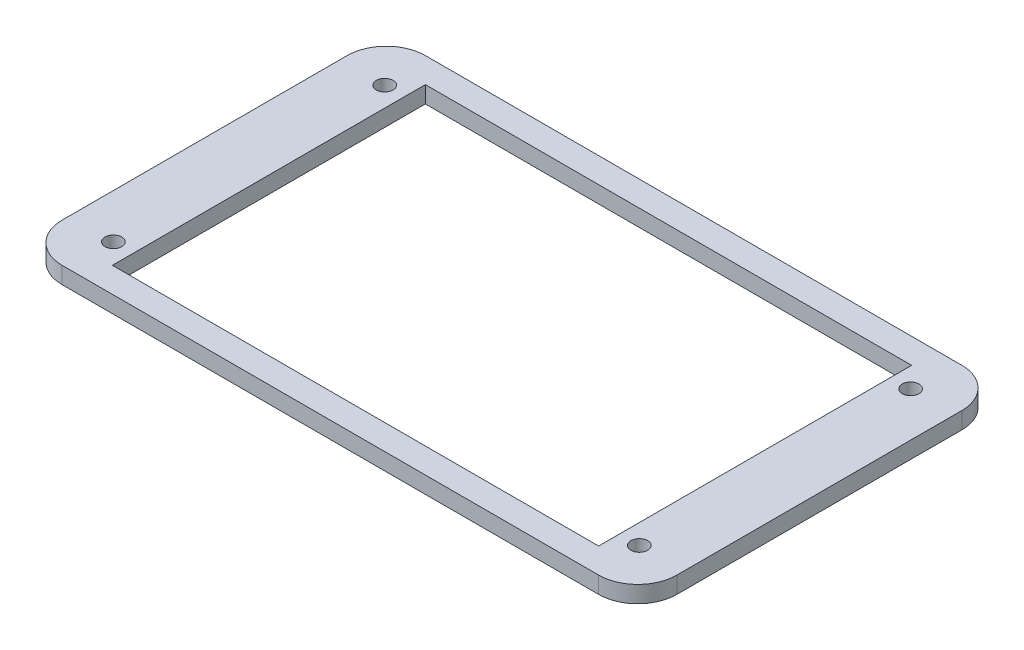
ISO-10303-21;
HEADER;
FILE_DESCRIPTION(('STEP AP214'),'2;1');
FILE_NAME('part.step','',(''),(''),'','','');
FILE_SCHEMA(('AUTOMOTIVE_DESIGN { 1 0 10303 214 1 1 1 1 }'));
ENDSEC;
DATA;
#1=APPLICATION_CONTEXT('core data for automotive mechanical design processes');
#2=APPLICATION_PROTOCOL_DEFINITION('international standard','automotive_design',2000,#1);
#3=PRODUCT_CONTEXT('',#1,'mechanical');
#4=PRODUCT('Part','Part','',(#3));
#5=PRODUCT_RELATED_PRODUCT_CATEGORY('part','',(#4));
#6=PRODUCT_DEFINITION_FORMATION('','',#4);
#7=PRODUCT_DEFINITION_CONTEXT('part definition',#1,'design');
#8=PRODUCT_DEFINITION('design','',#6,#7);
#9=PRODUCT_DEFINITION_SHAPE('','',#8);
#10=(LENGTH_UNIT() NAMED_UNIT(*) SI_UNIT(.MILLI.,.METRE.));
#11=(NAMED_UNIT(*) PLANE_ANGLE_UNIT() SI_UNIT($,.RADIAN.));
#12=(NAMED_UNIT(*) SI_UNIT($,.STERADIAN.) SOLID_ANGLE_UNIT());
#13=UNCERTAINTY_MEASURE_WITH_UNIT(LENGTH_MEASURE(1.E-05),#10,'distance_accuracy_value','');
#14=(GEOMETRIC_REPRESENTATION_CONTEXT(3) GLOBAL_UNCERTAINTY_ASSIGNED_CONTEXT((#13)) GLOBAL_UNIT_ASSIGNED_CONTEXT((#10,
#11,#12)) REPRESENTATION_CONTEXT('',''));
#15=CARTESIAN_POINT('',(0.,0.,0.));
#16=DIRECTION('',(0.,0.,1.));
#17=DIRECTION('',(1.,0.,0.));
#18=AXIS2_PLACEMENT_3D('',#15,#16,#17);
#19=CARTESIAN_POINT('',(-48.,1.5,25.5));
#20=DIRECTION('',(0.,-1.,0.));
#21=DIRECTION('',(0.,0.,-1.));
#22=AXIS2_PLACEMENT_3D('',#19,#20,#21);
#23=PLANE('',#22);
#24=DIRECTION('',(1.,0.,0.));
#25=VECTOR('',#24,1.);
#26=CARTESIAN_POINT('',(43.5,1.5,28.));
#27=LINE('',#26,#25);
#28=CARTESIAN_POINT('',(-43.5,1.5,28.));
#29=VERTEX_POINT('',#28);
#30=CARTESIAN_POINT('',(43.5,1.5,28.));
#31=VERTEX_POINT('',#30);
#32=EDGE_CURVE('E152',#29,#31,#27,.T.);
#33=ORIENTED_EDGE('',*,*,#32,.F.);
#34=DIRECTION('',(0.,0.,1.));
#35=VECTOR('',#34,1.);
#36=CARTESIAN_POINT('',(-43.5,1.5,28.));
#37=LINE('',#36,#35);
#38=CARTESIAN_POINT('',(-43.5,1.5,-28.));
#39=VERTEX_POINT('',#38);
#40=EDGE_CURVE('E54',#39,#29,#37,.T.);
#41=ORIENTED_EDGE('',*,*,#40,.F.);
#42=DIRECTION('',(-1.,0.,0.));
#43=VECTOR('',#42,1.);
#44=CARTESIAN_POINT('',(43.5,1.5,-28.));
#45=LINE('',#44,#43);
#46=CARTESIAN_POINT('',(43.5,1.5,-28.));
#47=VERTEX_POINT('',#46);
#48=EDGE_CURVE('E142',#47,#39,#45,.T.);
#49=ORIENTED_EDGE('',*,*,#48,.F.);
#50=DIRECTION('',(0.,0.,-1.));
#51=VECTOR('',#50,1.);
#52=CARTESIAN_POINT('',(43.5,1.5,28.));
#53=LINE('',#52,#51);
#54=EDGE_CURVE('E160',#31,#47,#53,.T.);
#55=ORIENTED_EDGE('',*,*,#54,.F.);
#56=EDGE_LOOP('',(#33,#41,#49,#55));
#57=FACE_BOUND('',#56,.T.);
#58=CARTESIAN_POINT('',(-48.,1.5,25.5));
#59=DIRECTION('',(0.,1.,0.));
#60=DIRECTION('',(0.,0.,-1.));
#61=AXIS2_PLACEMENT_3D('',#58,#59,#60);
#62=CIRCLE('',#61,7.00000000000001);
#63=CARTESIAN_POINT('',(-55.,1.5,25.5));
#64=VERTEX_POINT('',#63);
#65=CARTESIAN_POINT('',(-48.,1.5,32.5));
#66=VERTEX_POINT('',#65);
#67=EDGE_CURVE('E206',#64,#66,#62,.T.);
#68=ORIENTED_EDGE('',*,*,#67,.T.);
#69=DIRECTION('',(1.,0.,0.));
#70=VECTOR('',#69,1.);
#71=CARTESIAN_POINT('',(48.,1.5,32.5));
#72=LINE('',#71,#70);
#73=CARTESIAN_POINT('',(48.,1.5,32.5));
#74=VERTEX_POINT('',#73);
#75=EDGE_CURVE('E210',#66,#74,#72,.T.);
#76=ORIENTED_EDGE('',*,*,#75,.T.);
#77=CARTESIAN_POINT('',(48.,1.5,25.5));
#78=DIRECTION('',(0.,1.,0.));
#79=DIRECTION('',(0.,0.,1.));
#80=AXIS2_PLACEMENT_3D('',#77,#78,#79);
#81=CIRCLE('',#80,7.);
#82=CARTESIAN_POINT('',(55.,1.5,25.5));
#83=VERTEX_POINT('',#82);
#84=EDGE_CURVE('E214',#74,#83,#81,.T.);
#85=ORIENTED_EDGE('',*,*,#84,.T.);
#86=DIRECTION('',(0.,0.,-1.));
#87=VECTOR('',#86,1.);
#88=CARTESIAN_POINT('',(55.,1.5,25.5));
#89=LINE('',#88,#87);
#90=CARTESIAN_POINT('',(55.,1.5,-25.5));
#91=VERTEX_POINT('',#90);
#92=EDGE_CURVE('E217',#83,#91,#89,.T.);
#93=ORIENTED_EDGE('',*,*,#92,.T.);
#94=CARTESIAN_POINT('',(48.,1.5,-25.5));
#95=DIRECTION('',(0.,1.,0.));
#96=DIRECTION('',(0.,0.,1.));
#97=AXIS2_PLACEMENT_3D('',#94,#95,#96);
#98=CIRCLE('',#97,6.99999999999999);
#99=CARTESIAN_POINT('',(48.,1.5,-32.5));
#100=VERTEX_POINT('',#99);
#101=EDGE_CURVE('E220',#91,#100,#98,.T.);
#102=ORIENTED_EDGE('',*,*,#101,.T.);
#103=DIRECTION('',(-1.,0.,0.));
#104=VECTOR('',#103,1.);
#105=CARTESIAN_POINT('',(48.,1.5,-32.5));
#106=LINE('',#105,#104);
#107=CARTESIAN_POINT('',(-48.,1.5,-32.5));
#108=VERTEX_POINT('',#107);
#109=EDGE_CURVE('E223',#100,#108,#106,.T.);
#110=ORIENTED_EDGE('',*,*,#109,.T.);
#111=CARTESIAN_POINT('',(-48.,1.5,-25.5));
#112=DIRECTION('',(0.,1.,0.));
#113=DIRECTION('',(0.,0.,1.));
#114=AXIS2_PLACEMENT_3D('',#111,#112,#113);
#115=CIRCLE('',#114,7.);
#116=CARTESIAN_POINT('',(-55.,1.5,-25.5));
#117=VERTEX_POINT('',#116);
#118=EDGE_CURVE('E226',#108,#117,#115,.T.);
#119=ORIENTED_EDGE('',*,*,#118,.T.);
#120=DIRECTION('',(0.,0.,1.));
#121=VECTOR('',#120,1.);
#122=CARTESIAN_POINT('',(-55.,1.5,25.5));
#123=LINE('',#122,#121);
#124=EDGE_CURVE('E229',#117,#64,#123,.T.);
#125=ORIENTED_EDGE('',*,*,#124,.T.);
#126=EDGE_LOOP('',(#68,#76,#85,#93,#102,#110,#119,#125));
#127=FACE_BOUND('',#126,.T.);
#128=CARTESIAN_POINT('',(-47.05,1.5,-24.27));
#129=DIRECTION('',(0.,1.,0.));
#130=DIRECTION('',(0.,0.,1.));
#131=AXIS2_PLACEMENT_3D('',#128,#129,#130);
#132=CIRCLE('',#131,1.5);
#133=CARTESIAN_POINT('',(-47.05,1.5,-22.77));
#134=VERTEX_POINT('',#133);
#135=EDGE_CURVE('E198',#134,#134,#132,.T.);
#136=ORIENTED_EDGE('',*,*,#135,.F.);
#137=EDGE_LOOP('',(#136));
#138=FACE_BOUND('',#137,.T.);
#139=CARTESIAN_POINT('',(-47.05,1.5,24.27));
#140=DIRECTION('',(0.,1.,0.));
#141=DIRECTION('',(0.,0.,1.));
#142=AXIS2_PLACEMENT_3D('',#139,#140,#141);
#143=CIRCLE('',#142,1.5);
#144=CARTESIAN_POINT('',(-47.05,1.5,25.77));
#145=VERTEX_POINT('',#144);
#146=EDGE_CURVE('E190',#145,#145,#143,.T.);
#147=ORIENTED_EDGE('',*,*,#146,.F.);
#148=EDGE_LOOP('',(#147));
#149=FACE_BOUND('',#148,.T.);
#150=CARTESIAN_POINT('',(47.05,1.5,24.27));
#151=DIRECTION('',(0.,1.,0.));
#152=DIRECTION('',(0.,0.,1.));
#153=AXIS2_PLACEMENT_3D('',#150,#151,#152);
#154=CIRCLE('',#153,1.5);
#155=CARTESIAN_POINT('',(47.05,1.5,25.77));
#156=VERTEX_POINT('',#155);
#157=EDGE_CURVE('E182',#156,#156,#154,.T.);
#158=ORIENTED_EDGE('',*,*,#157,.F.);
#159=EDGE_LOOP('',(#158));
#160=FACE_BOUND('',#159,.T.);
#161=CARTESIAN_POINT('',(47.05,1.5,-24.27));
#162=DIRECTION('',(0.,1.,0.));
#163=DIRECTION('',(0.,0.,1.));
#164=AXIS2_PLACEMENT_3D('',#161,#162,#163);
#165=CIRCLE('',#164,1.5);
#166=CARTESIAN_POINT('',(47.05,1.5,-22.77));
#167=VERTEX_POINT('',#166);
#168=EDGE_CURVE('E174',#167,#167,#165,.T.);
#169=ORIENTED_EDGE('',*,*,#168,.F.);
#170=EDGE_LOOP('',(#169));
#171=FACE_BOUND('',#170,.T.);
#172=ADVANCED_FACE('F38',(#57,#127,#138,#149,#160,#171),#23,.F.);
#173=CARTESIAN_POINT('',(-48.,-1.5,25.5));
#174=DIRECTION('',(0.,-1.,0.));
#175=DIRECTION('',(0.,0.,-1.));
#176=AXIS2_PLACEMENT_3D('',#173,#174,#175);
#177=PLANE('',#176);
#178=DIRECTION('',(0.,0.,1.));
#179=VECTOR('',#178,1.);
#180=CARTESIAN_POINT('',(-43.5,-1.5,28.));
#181=LINE('',#180,#179);
#182=CARTESIAN_POINT('',(-43.5,-1.5,-28.));
#183=VERTEX_POINT('',#182);
#184=CARTESIAN_POINT('',(-43.5,-1.5,28.));
#185=VERTEX_POINT('',#184);
#186=EDGE_CURVE('E139',#183,#185,#181,.T.);
#187=ORIENTED_EDGE('',*,*,#186,.T.);
#188=DIRECTION('',(1.,0.,0.));
#189=VECTOR('',#188,1.);
#190=CARTESIAN_POINT('',(43.5,-1.5,28.));
#191=LINE('',#190,#189);
#192=CARTESIAN_POINT('',(43.5,-1.5,28.));
#193=VERTEX_POINT('',#192);
#194=EDGE_CURVE('E127',#185,#193,#191,.T.);
#195=ORIENTED_EDGE('',*,*,#194,.T.);
#196=DIRECTION('',(0.,0.,-1.));
#197=VECTOR('',#196,1.);
#198=CARTESIAN_POINT('',(43.5,-1.5,28.));
#199=LINE('',#198,#197);
#200=CARTESIAN_POINT('',(43.5,-1.5,-28.));
#201=VERTEX_POINT('',#200);
#202=EDGE_CURVE('E154',#193,#201,#199,.T.);
#203=ORIENTED_EDGE('',*,*,#202,.T.);
#204=DIRECTION('',(-1.,0.,0.));
#205=VECTOR('',#204,1.);
#206=CARTESIAN_POINT('',(43.5,-1.5,-28.));
#207=LINE('',#206,#205);
#208=EDGE_CURVE('E147',#201,#183,#207,.T.);
#209=ORIENTED_EDGE('',*,*,#208,.T.);
#210=EDGE_LOOP('',(#187,#195,#203,#209));
#211=FACE_BOUND('',#210,.T.);
#212=CARTESIAN_POINT('',(47.05,-1.5,24.27));
#213=DIRECTION('',(0.,1.,0.));
#214=DIRECTION('',(0.,0.,1.));
#215=AXIS2_PLACEMENT_3D('',#212,#213,#214);
#216=CIRCLE('',#215,1.5);
#217=CARTESIAN_POINT('',(47.05,-1.5,25.77));
#218=VERTEX_POINT('',#217);
#219=EDGE_CURVE('E178',#218,#218,#216,.T.);
#220=ORIENTED_EDGE('',*,*,#219,.T.);
#221=EDGE_LOOP('',(#220));
#222=FACE_BOUND('',#221,.T.);
#223=CARTESIAN_POINT('',(-47.05,-1.5,-24.27));
#224=DIRECTION('',(0.,1.,0.));
#225=DIRECTION('',(0.,0.,1.));
#226=AXIS2_PLACEMENT_3D('',#223,#224,#225);
#227=CIRCLE('',#226,1.5);
#228=CARTESIAN_POINT('',(-47.05,-1.5,-22.77));
#229=VERTEX_POINT('',#228);
#230=EDGE_CURVE('E194',#229,#229,#227,.T.);
#231=ORIENTED_EDGE('',*,*,#230,.T.);
#232=EDGE_LOOP('',(#231));
#233=FACE_BOUND('',#232,.T.);
#234=CARTESIAN_POINT('',(-48.,-1.5,25.5));
#235=DIRECTION('',(0.,1.,0.));
#236=DIRECTION('',(0.,0.,-1.));
#237=AXIS2_PLACEMENT_3D('',#234,#235,#236);
#238=CIRCLE('',#237,7.00000000000001);
#239=CARTESIAN_POINT('',(-55.,-1.5,25.5));
#240=VERTEX_POINT('',#239);
#241=CARTESIAN_POINT('',(-48.,-1.5,32.5));
#242=VERTEX_POINT('',#241);
#243=EDGE_CURVE('E202',#240,#242,#238,.T.);
#244=ORIENTED_EDGE('',*,*,#243,.F.);
#245=DIRECTION('',(0.,0.,1.));
#246=VECTOR('',#245,1.);
#247=CARTESIAN_POINT('',(-55.,-1.5,25.5));
#248=LINE('',#247,#246);
#249=CARTESIAN_POINT('',(-55.,-1.5,-25.5));
#250=VERTEX_POINT('',#249);
#251=EDGE_CURVE('E211',#250,#240,#248,.T.);
#252=ORIENTED_EDGE('',*,*,#251,.F.);
#253=CARTESIAN_POINT('',(-48.,-1.5,-25.5));
#254=DIRECTION('',(0.,1.,0.));
#255=DIRECTION('',(0.,0.,1.));
#256=AXIS2_PLACEMENT_3D('',#253,#254,#255);
#257=CIRCLE('',#256,7.);
#258=CARTESIAN_POINT('',(-48.,-1.5,-32.5));
#259=VERTEX_POINT('',#258);
#260=EDGE_CURVE('E251',#259,#250,#257,.T.);
#261=ORIENTED_EDGE('',*,*,#260,.F.);
#262=DIRECTION('',(-1.,0.,0.));
#263=VECTOR('',#262,1.);
#264=CARTESIAN_POINT('',(48.,-1.5,-32.5));
#265=LINE('',#264,#263);
#266=CARTESIAN_POINT('',(48.,-1.5,-32.5));
#267=VERTEX_POINT('',#266);
#268=EDGE_CURVE('E248',#267,#259,#265,.T.);
#269=ORIENTED_EDGE('',*,*,#268,.F.);
#270=CARTESIAN_POINT('',(48.,-1.5,-25.5));
#271=DIRECTION('',(0.,1.,0.));
#272=DIRECTION('',(0.,0.,1.));
#273=AXIS2_PLACEMENT_3D('',#270,#271,#272);
#274=CIRCLE('',#273,6.99999999999999);
#275=CARTESIAN_POINT('',(55.,-1.5,-25.5));
#276=VERTEX_POINT('',#275);
#277=EDGE_CURVE('E245',#276,#267,#274,.T.);
#278=ORIENTED_EDGE('',*,*,#277,.F.);
#279=DIRECTION('',(0.,0.,-1.));
#280=VECTOR('',#279,1.);
#281=CARTESIAN_POINT('',(55.,-1.5,25.5));
#282=LINE('',#281,#280);
#283=CARTESIAN_POINT('',(55.,-1.5,25.5));
#284=VERTEX_POINT('',#283);
#285=EDGE_CURVE('E242',#284,#276,#282,.T.);
#286=ORIENTED_EDGE('',*,*,#285,.F.);
#287=CARTESIAN_POINT('',(48.,-1.5,25.5));
#288=DIRECTION('',(0.,1.,0.));
#289=DIRECTION('',(0.,0.,1.));
#290=AXIS2_PLACEMENT_3D('',#287,#288,#289);
#291=CIRCLE('',#290,7.);
#292=CARTESIAN_POINT('',(48.,-1.5,32.5));
#293=VERTEX_POINT('',#292);
#294=EDGE_CURVE('E239',#293,#284,#291,.T.);
#295=ORIENTED_EDGE('',*,*,#294,.F.);
#296=DIRECTION('',(1.,0.,0.));
#297=VECTOR('',#296,1.);
#298=CARTESIAN_POINT('',(48.,-1.5,32.5));
#299=LINE('',#298,#297);
#300=EDGE_CURVE('E236',#242,#293,#299,.T.);
#301=ORIENTED_EDGE('',*,*,#300,.F.);
#302=EDGE_LOOP('',(#244,#252,#261,#269,#278,#286,#295,#301));
#303=FACE_BOUND('',#302,.T.);
#304=CARTESIAN_POINT('',(-47.05,-1.5,24.27));
#305=DIRECTION('',(0.,1.,0.));
#306=DIRECTION('',(0.,0.,1.));
#307=AXIS2_PLACEMENT_3D('',#304,#305,#306);
#308=CIRCLE('',#307,1.5);
#309=CARTESIAN_POINT('',(-47.05,-1.5,25.77));
#310=VERTEX_POINT('',#309);
#311=EDGE_CURVE('E186',#310,#310,#308,.T.);
#312=ORIENTED_EDGE('',*,*,#311,.T.);
#313=EDGE_LOOP('',(#312));
#314=FACE_BOUND('',#313,.T.);
#315=CARTESIAN_POINT('',(47.05,-1.5,-24.27));
#316=DIRECTION('',(0.,1.,0.));
#317=DIRECTION('',(0.,0.,1.));
#318=AXIS2_PLACEMENT_3D('',#315,#316,#317);
#319=CIRCLE('',#318,1.5);
#320=CARTESIAN_POINT('',(47.05,-1.5,-22.77));
#321=VERTEX_POINT('',#320);
#322=EDGE_CURVE('E135',#321,#321,#319,.T.);
#323=ORIENTED_EDGE('',*,*,#322,.T.);
#324=EDGE_LOOP('',(#323));
#325=FACE_BOUND('',#324,.T.);
#326=ADVANCED_FACE('F145',(#211,#222,#233,#303,#314,#325),#177,.T.);
#327=CARTESIAN_POINT('',(-48.,1.5,25.5));
#328=DIRECTION('',(0.,-1.,0.));
#329=DIRECTION('',(0.,0.,-1.));
#330=AXIS2_PLACEMENT_3D('',#327,#328,#329);
#331=CYLINDRICAL_SURFACE('',#330,7.00000000000001);
#332=ORIENTED_EDGE('',*,*,#243,.T.);
#333=DIRECTION('',(0.,-1.,0.));
#334=VECTOR('',#333,1.);
#335=CARTESIAN_POINT('',(-48.,1.5,32.5));
#336=LINE('',#335,#334);
#337=EDGE_CURVE('E11',#66,#242,#336,.T.);
#338=ORIENTED_EDGE('',*,*,#337,.F.);
#339=ORIENTED_EDGE('',*,*,#67,.F.);
#340=DIRECTION('',(0.,-1.,0.));
#341=VECTOR('',#340,1.);
#342=CARTESIAN_POINT('',(-55.,1.5,25.5));
#343=LINE('',#342,#341);
#344=EDGE_CURVE('E232',#64,#240,#343,.T.);
#345=ORIENTED_EDGE('',*,*,#344,.T.);
#346=EDGE_LOOP('',(#332,#338,#339,#345));
#347=FACE_BOUND('',#346,.T.);
#348=ADVANCED_FACE('F40',(#347),#331,.T.);
#349=CARTESIAN_POINT('',(48.,1.5,32.5));
#350=DIRECTION('',(0.,0.,-1.));
#351=DIRECTION('',(-1.,0.,0.));
#352=AXIS2_PLACEMENT_3D('',#349,#350,#351);
#353=PLANE('',#352);
#354=ORIENTED_EDGE('',*,*,#300,.T.);
#355=DIRECTION('',(0.,-1.,0.));
#356=VECTOR('',#355,1.);
#357=CARTESIAN_POINT('',(48.,1.5,32.5));
#358=LINE('',#357,#356);
#359=EDGE_CURVE('E47',#74,#293,#358,.T.);
#360=ORIENTED_EDGE('',*,*,#359,.F.);
#361=ORIENTED_EDGE('',*,*,#75,.F.);
#362=ORIENTED_EDGE('',*,*,#337,.T.);
#363=EDGE_LOOP('',(#354,#360,#361,#362));
#364=FACE_BOUND('',#363,.T.);
#365=ADVANCED_FACE('F307',(#364),#353,.F.);
#366=CARTESIAN_POINT('',(48.,1.5,25.5));
#367=DIRECTION('',(0.,-1.,0.));
#368=DIRECTION('',(0.,0.,-1.));
#369=AXIS2_PLACEMENT_3D('',#366,#367,#368);
#370=CYLINDRICAL_SURFACE('',#369,7.);
#371=ORIENTED_EDGE('',*,*,#294,.T.);
#372=DIRECTION('',(0.,-1.,0.));
#373=VECTOR('',#372,1.);
#374=CARTESIAN_POINT('',(55.,1.5,25.5));
#375=LINE('',#374,#373);
#376=EDGE_CURVE('E275',#83,#284,#375,.T.);
#377=ORIENTED_EDGE('',*,*,#376,.F.);
#378=ORIENTED_EDGE('',*,*,#84,.F.);
#379=ORIENTED_EDGE('',*,*,#359,.T.);
#380=EDGE_LOOP('',(#371,#377,#378,#379));
#381=FACE_BOUND('',#380,.T.);
#382=ADVANCED_FACE('F284',(#381),#370,.T.);
#383=CARTESIAN_POINT('',(55.,1.5,25.5));
#384=DIRECTION('',(-1.,0.,0.));
#385=DIRECTION('',(0.,0.,1.));
#386=AXIS2_PLACEMENT_3D('',#383,#384,#385);
#387=PLANE('',#386);
#388=ORIENTED_EDGE('',*,*,#285,.T.);
#389=DIRECTION('',(0.,-1.,0.));
#390=VECTOR('',#389,1.);
#391=CARTESIAN_POINT('',(55.,1.5,-25.5));
#392=LINE('',#391,#390);
#393=EDGE_CURVE('E271',#91,#276,#392,.T.);
#394=ORIENTED_EDGE('',*,*,#393,.F.);
#395=ORIENTED_EDGE('',*,*,#92,.F.);
#396=ORIENTED_EDGE('',*,*,#376,.T.);
#397=EDGE_LOOP('',(#388,#394,#395,#396));
#398=FACE_BOUND('',#397,.T.);
#399=ADVANCED_FACE('F295',(#398),#387,.F.);
#400=CARTESIAN_POINT('',(48.,1.5,-25.5));
#401=DIRECTION('',(0.,-1.,0.));
#402=DIRECTION('',(0.,0.,-1.));
#403=AXIS2_PLACEMENT_3D('',#400,#401,#402);
#404=CYLINDRICAL_SURFACE('',#403,6.99999999999999);
#405=ORIENTED_EDGE('',*,*,#277,.T.);
#406=DIRECTION('',(0.,-1.,0.));
#407=VECTOR('',#406,1.);
#408=CARTESIAN_POINT('',(48.,1.5,-32.5));
#409=LINE('',#408,#407);
#410=EDGE_CURVE('E267',#100,#267,#409,.T.);
#411=ORIENTED_EDGE('',*,*,#410,.F.);
#412=ORIENTED_EDGE('',*,*,#101,.F.);
#413=ORIENTED_EDGE('',*,*,#393,.T.);
#414=EDGE_LOOP('',(#405,#411,#412,#413));
#415=FACE_BOUND('',#414,.T.);
#416=ADVANCED_FACE('F299',(#415),#404,.T.);
#417=CARTESIAN_POINT('',(48.,1.5,-32.5));
#418=DIRECTION('',(0.,0.,1.));
#419=DIRECTION('',(1.,0.,0.));
#420=AXIS2_PLACEMENT_3D('',#417,#418,#419);
#421=PLANE('',#420);
#422=ORIENTED_EDGE('',*,*,#268,.T.);
#423=DIRECTION('',(0.,-1.,0.));
#424=VECTOR('',#423,1.);
#425=CARTESIAN_POINT('',(-48.,1.5,-32.5));
#426=LINE('',#425,#424);
#427=EDGE_CURVE('E263',#108,#259,#426,.T.);
#428=ORIENTED_EDGE('',*,*,#427,.F.);
#429=ORIENTED_EDGE('',*,*,#109,.F.);
#430=ORIENTED_EDGE('',*,*,#410,.T.);
#431=EDGE_LOOP('',(#422,#428,#429,#430));
#432=FACE_BOUND('',#431,.T.);
#433=ADVANCED_FACE('F320',(#432),#421,.F.);
#434=CARTESIAN_POINT('',(-48.,1.5,-25.5));
#435=DIRECTION('',(0.,-1.,0.));
#436=DIRECTION('',(0.,0.,-1.));
#437=AXIS2_PLACEMENT_3D('',#434,#435,#436);
#438=CYLINDRICAL_SURFACE('',#437,7.);
#439=ORIENTED_EDGE('',*,*,#260,.T.);
#440=DIRECTION('',(0.,-1.,0.));
#441=VECTOR('',#440,1.);
#442=CARTESIAN_POINT('',(-55.,1.5,-25.5));
#443=LINE('',#442,#441);
#444=EDGE_CURVE('E259',#117,#250,#443,.T.);
#445=ORIENTED_EDGE('',*,*,#444,.F.);
#446=ORIENTED_EDGE('',*,*,#118,.F.);
#447=ORIENTED_EDGE('',*,*,#427,.T.);
#448=EDGE_LOOP('',(#439,#445,#446,#447));
#449=FACE_BOUND('',#448,.T.);
#450=ADVANCED_FACE('F318',(#449),#438,.T.);
#451=CARTESIAN_POINT('',(-55.,1.5,25.5));
#452=DIRECTION('',(1.,0.,0.));
#453=DIRECTION('',(0.,0.,-1.));
#454=AXIS2_PLACEMENT_3D('',#451,#452,#453);
#455=PLANE('',#454);
#456=ORIENTED_EDGE('',*,*,#251,.T.);
#457=ORIENTED_EDGE('',*,*,#344,.F.);
#458=ORIENTED_EDGE('',*,*,#124,.F.);
#459=ORIENTED_EDGE('',*,*,#444,.T.);
#460=EDGE_LOOP('',(#456,#457,#458,#459));
#461=FACE_BOUND('',#460,.T.);
#462=ADVANCED_FACE('F313',(#461),#455,.F.);
#463=CARTESIAN_POINT('',(-47.05,1.5,-24.27));
#464=DIRECTION('',(0.,-1.,0.));
#465=DIRECTION('',(0.,0.,-1.));
#466=AXIS2_PLACEMENT_3D('',#463,#464,#465);
#467=CYLINDRICAL_SURFACE('',#466,1.5);
#468=ORIENTED_EDGE('',*,*,#135,.T.);
#469=EDGE_LOOP('',(#468));
#470=FACE_BOUND('',#469,.T.);
#471=ORIENTED_EDGE('',*,*,#230,.F.);
#472=EDGE_LOOP('',(#471));
#473=FACE_BOUND('',#472,.T.);
#474=ADVANCED_FACE('F338',(#470,#473),#467,.F.);
#475=CARTESIAN_POINT('',(-47.05,1.5,24.27));
#476=DIRECTION('',(0.,-1.,0.));
#477=DIRECTION('',(0.,0.,-1.));
#478=AXIS2_PLACEMENT_3D('',#475,#476,#477);
#479=CYLINDRICAL_SURFACE('',#478,1.5);
#480=ORIENTED_EDGE('',*,*,#146,.T.);
#481=EDGE_LOOP('',(#480));
#482=FACE_BOUND('',#481,.T.);
#483=ORIENTED_EDGE('',*,*,#311,.F.);
#484=EDGE_LOOP('',(#483));
#485=FACE_BOUND('',#484,.T.);
#486=ADVANCED_FACE('F345',(#482,#485),#479,.F.);
#487=CARTESIAN_POINT('',(47.05,1.5,24.27));
#488=DIRECTION('',(0.,-1.,0.));
#489=DIRECTION('',(0.,0.,-1.));
#490=AXIS2_PLACEMENT_3D('',#487,#488,#489);
#491=CYLINDRICAL_SURFACE('',#490,1.5);
#492=ORIENTED_EDGE('',*,*,#157,.T.);
#493=EDGE_LOOP('',(#492));
#494=FACE_BOUND('',#493,.T.);
#495=ORIENTED_EDGE('',*,*,#219,.F.);
#496=EDGE_LOOP('',(#495));
#497=FACE_BOUND('',#496,.T.);
#498=ADVANCED_FACE('F350',(#494,#497),#491,.F.);
#499=CARTESIAN_POINT('',(47.05,1.5,-24.27));
#500=DIRECTION('',(0.,-1.,0.));
#501=DIRECTION('',(0.,0.,-1.));
#502=AXIS2_PLACEMENT_3D('',#499,#500,#501);
#503=CYLINDRICAL_SURFACE('',#502,1.5);
#504=ORIENTED_EDGE('',*,*,#168,.T.);
#505=EDGE_LOOP('',(#504));
#506=FACE_BOUND('',#505,.T.);
#507=ORIENTED_EDGE('',*,*,#322,.F.);
#508=EDGE_LOOP('',(#507));
#509=FACE_BOUND('',#508,.T.);
#510=ADVANCED_FACE('F363',(#506,#509),#503,.F.);
#511=CARTESIAN_POINT('',(-43.5,-1.501,28.));
#512=DIRECTION('',(-1.,0.,0.));
#513=DIRECTION('',(0.,0.,1.));
#514=AXIS2_PLACEMENT_3D('',#511,#512,#513);
#515=PLANE('',#514);
#516=DIRECTION('',(0.,1.,0.));
#517=VECTOR('',#516,1.);
#518=CARTESIAN_POINT('',(-43.5,-1.501,-28.));
#519=LINE('',#518,#517);
#520=EDGE_CURVE('E136',#183,#39,#519,.T.);
#521=ORIENTED_EDGE('',*,*,#520,.T.);
#522=ORIENTED_EDGE('',*,*,#40,.T.);
#523=DIRECTION('',(0.,1.,0.));
#524=VECTOR('',#523,1.);
#525=CARTESIAN_POINT('',(-43.5,-1.501,28.));
#526=LINE('',#525,#524);
#527=EDGE_CURVE('E129',#185,#29,#526,.T.);
#528=ORIENTED_EDGE('',*,*,#527,.F.);
#529=ORIENTED_EDGE('',*,*,#186,.F.);
#530=EDGE_LOOP('',(#521,#522,#528,#529));
#531=FACE_BOUND('',#530,.T.);
#532=ADVANCED_FACE('F138',(#531),#515,.F.);
#533=CARTESIAN_POINT('',(43.5,-1.501,-28.));
#534=DIRECTION('',(0.,0.,-1.));
#535=DIRECTION('',(-1.,0.,0.));
#536=AXIS2_PLACEMENT_3D('',#533,#534,#535);
#537=PLANE('',#536);
#538=DIRECTION('',(0.,1.,0.));
#539=VECTOR('',#538,1.);
#540=CARTESIAN_POINT('',(43.5,-1.501,-28.));
#541=LINE('',#540,#539);
#542=EDGE_CURVE('E169',#201,#47,#541,.T.);
#543=ORIENTED_EDGE('',*,*,#542,.T.);
#544=ORIENTED_EDGE('',*,*,#48,.T.);
#545=ORIENTED_EDGE('',*,*,#520,.F.);
#546=ORIENTED_EDGE('',*,*,#208,.F.);
#547=EDGE_LOOP('',(#543,#544,#545,#546));
#548=FACE_BOUND('',#547,.T.);
#549=ADVANCED_FACE('F372',(#548),#537,.F.);
#550=CARTESIAN_POINT('',(43.5,-1.501,28.));
#551=DIRECTION('',(1.,0.,0.));
#552=DIRECTION('',(0.,0.,-1.));
#553=AXIS2_PLACEMENT_3D('',#550,#551,#552);
#554=PLANE('',#553);
#555=DIRECTION('',(0.,1.,0.));
#556=VECTOR('',#555,1.);
#557=CARTESIAN_POINT('',(43.5,-1.501,28.));
#558=LINE('',#557,#556);
#559=EDGE_CURVE('E62',#193,#31,#558,.T.);
#560=ORIENTED_EDGE('',*,*,#559,.T.);
#561=ORIENTED_EDGE('',*,*,#54,.T.);
#562=ORIENTED_EDGE('',*,*,#542,.F.);
#563=ORIENTED_EDGE('',*,*,#202,.F.);
#564=EDGE_LOOP('',(#560,#561,#562,#563));
#565=FACE_BOUND('',#564,.T.);
#566=ADVANCED_FACE('F379',(#565),#554,.F.);
#567=CARTESIAN_POINT('',(43.5,-1.501,28.));
#568=DIRECTION('',(0.,0.,1.));
#569=DIRECTION('',(1.,0.,0.));
#570=AXIS2_PLACEMENT_3D('',#567,#568,#569);
#571=PLANE('',#570);
#572=ORIENTED_EDGE('',*,*,#527,.T.);
#573=ORIENTED_EDGE('',*,*,#32,.T.);
#574=ORIENTED_EDGE('',*,*,#559,.F.);
#575=ORIENTED_EDGE('',*,*,#194,.F.);
#576=EDGE_LOOP('',(#572,#573,#574,#575));
#577=FACE_BOUND('',#576,.T.);
#578=ADVANCED_FACE('F128',(#577),#571,.F.);
#579=CLOSED_SHELL('',(#172,#326,#348,#365,#382,#399,#416,#433,#450,#462,#474,#486,#498,#510,
#532,#549,#566,#578));
#580=MANIFOLD_SOLID_BREP('B2',#579);
#581=ADVANCED_BREP_SHAPE_REPRESENTATION('',(#18,#580),#14);
#582=SHAPE_DEFINITION_REPRESENTATION(#9,#581);
ENDSEC;
END-ISO-10303-21;
